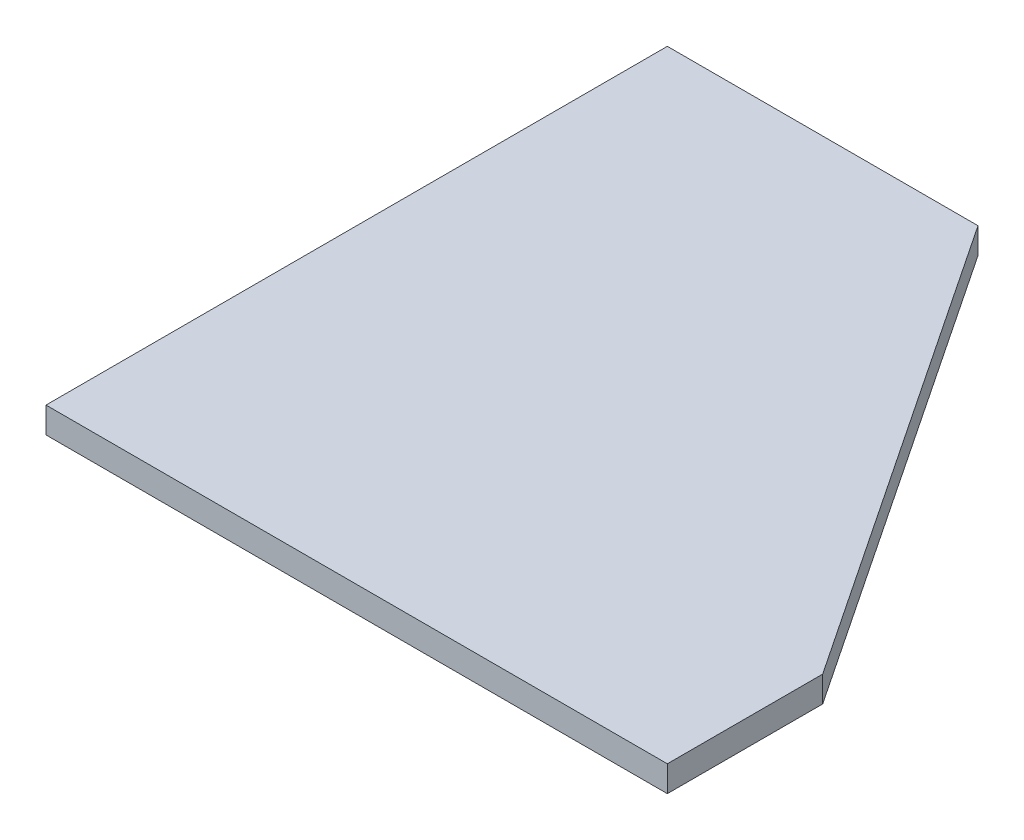
ISO-10303-21;
HEADER;
FILE_DESCRIPTION(('STEP AP214'),'2;1');
FILE_NAME('part.step','',(''),(''),'','','');
FILE_SCHEMA(('AUTOMOTIVE_DESIGN { 1 0 10303 214 1 1 1 1 }'));
ENDSEC;
DATA;
#1=APPLICATION_CONTEXT('core data for automotive mechanical design processes');
#2=APPLICATION_PROTOCOL_DEFINITION('international standard','automotive_design',2000,#1);
#3=PRODUCT_CONTEXT('',#1,'mechanical');
#4=PRODUCT('Part','Part','',(#3));
#5=PRODUCT_RELATED_PRODUCT_CATEGORY('part','',(#4));
#6=PRODUCT_DEFINITION_FORMATION('','',#4);
#7=PRODUCT_DEFINITION_CONTEXT('part definition',#1,'design');
#8=PRODUCT_DEFINITION('design','',#6,#7);
#9=PRODUCT_DEFINITION_SHAPE('','',#8);
#10=(LENGTH_UNIT() NAMED_UNIT(*) SI_UNIT(.MILLI.,.METRE.));
#11=(NAMED_UNIT(*) PLANE_ANGLE_UNIT() SI_UNIT($,.RADIAN.));
#12=(NAMED_UNIT(*) SI_UNIT($,.STERADIAN.) SOLID_ANGLE_UNIT());
#13=UNCERTAINTY_MEASURE_WITH_UNIT(LENGTH_MEASURE(1.E-05),#10,'distance_accuracy_value','');
#14=(GEOMETRIC_REPRESENTATION_CONTEXT(3) GLOBAL_UNCERTAINTY_ASSIGNED_CONTEXT((#13)) GLOBAL_UNIT_ASSIGNED_CONTEXT((#10,
#11,#12)) REPRESENTATION_CONTEXT('',''));
#15=CARTESIAN_POINT('',(0.,0.,0.));
#16=DIRECTION('',(0.,0.,1.));
#17=DIRECTION('',(1.,0.,0.));
#18=AXIS2_PLACEMENT_3D('',#15,#16,#17);
#19=CARTESIAN_POINT('',(152.4,6.35,0.));
#20=DIRECTION('',(0.,0.,-1.));
#21=DIRECTION('',(-1.,0.,0.));
#22=AXIS2_PLACEMENT_3D('',#19,#20,#21);
#23=PLANE('',#22);
#24=DIRECTION('',(1.,0.,0.));
#25=VECTOR('',#24,1.);
#26=CARTESIAN_POINT('',(152.4,0.,0.));
#27=LINE('',#26,#25);
#28=CARTESIAN_POINT('',(0.,0.,0.));
#29=VERTEX_POINT('',#28);
#30=CARTESIAN_POINT('',(152.4,0.,0.));
#31=VERTEX_POINT('',#30);
#32=EDGE_CURVE('E107',#29,#31,#27,.T.);
#33=ORIENTED_EDGE('',*,*,#32,.T.);
#34=DIRECTION('',(0.,-1.,0.));
#35=VECTOR('',#34,1.);
#36=CARTESIAN_POINT('',(152.4,6.35,0.));
#37=LINE('',#36,#35);
#38=CARTESIAN_POINT('',(152.4,6.35,0.));
#39=VERTEX_POINT('',#38);
#40=EDGE_CURVE('E11',#39,#31,#37,.T.);
#41=ORIENTED_EDGE('',*,*,#40,.F.);
#42=DIRECTION('',(1.,0.,0.));
#43=VECTOR('',#42,1.);
#44=CARTESIAN_POINT('',(152.4,6.35,0.));
#45=LINE('',#44,#43);
#46=CARTESIAN_POINT('',(0.,6.35,0.));
#47=VERTEX_POINT('',#46);
#48=EDGE_CURVE('E115',#47,#39,#45,.T.);
#49=ORIENTED_EDGE('',*,*,#48,.F.);
#50=DIRECTION('',(0.,-1.,0.));
#51=VECTOR('',#50,1.);
#52=CARTESIAN_POINT('',(0.,6.35,0.));
#53=LINE('',#52,#51);
#54=EDGE_CURVE('E103',#47,#29,#53,.T.);
#55=ORIENTED_EDGE('',*,*,#54,.T.);
#56=EDGE_LOOP('',(#33,#41,#49,#55));
#57=FACE_BOUND('',#56,.T.);
#58=ADVANCED_FACE('F33',(#57),#23,.F.);
#59=CARTESIAN_POINT('',(152.4,6.35,-38.1));
#60=DIRECTION('',(-1.,0.,0.));
#61=DIRECTION('',(0.,0.,1.));
#62=AXIS2_PLACEMENT_3D('',#59,#60,#61);
#63=PLANE('',#62);
#64=DIRECTION('',(0.,0.,-1.));
#65=VECTOR('',#64,1.);
#66=CARTESIAN_POINT('',(152.4,0.,-38.1));
#67=LINE('',#66,#65);
#68=CARTESIAN_POINT('',(152.4,0.,-38.1));
#69=VERTEX_POINT('',#68);
#70=EDGE_CURVE('E110',#31,#69,#67,.T.);
#71=ORIENTED_EDGE('',*,*,#70,.T.);
#72=DIRECTION('',(0.,-1.,0.));
#73=VECTOR('',#72,1.);
#74=CARTESIAN_POINT('',(152.4,6.35,-38.1));
#75=LINE('',#74,#73);
#76=CARTESIAN_POINT('',(152.4,6.35,-38.1));
#77=VERTEX_POINT('',#76);
#78=EDGE_CURVE('E41',#77,#69,#75,.T.);
#79=ORIENTED_EDGE('',*,*,#78,.F.);
#80=DIRECTION('',(0.,0.,-1.));
#81=VECTOR('',#80,1.);
#82=CARTESIAN_POINT('',(152.4,6.35,-38.1));
#83=LINE('',#82,#81);
#84=EDGE_CURVE('E83',#39,#77,#83,.T.);
#85=ORIENTED_EDGE('',*,*,#84,.F.);
#86=ORIENTED_EDGE('',*,*,#40,.T.);
#87=EDGE_LOOP('',(#71,#79,#85,#86));
#88=FACE_BOUND('',#87,.T.);
#89=ADVANCED_FACE('F134',(#88),#63,.F.);
#90=CARTESIAN_POINT('',(76.2,6.35,-152.4));
#91=DIRECTION('',(-0.832050294337844,0.,0.554700196225229));
#92=DIRECTION('',(0.554700196225229,0.,0.832050294337844));
#93=AXIS2_PLACEMENT_3D('',#90,#91,#92);
#94=PLANE('',#93);
#95=DIRECTION('',(-0.554700196225229,0.,-0.832050294337844));
#96=VECTOR('',#95,1.);
#97=CARTESIAN_POINT('',(76.2,0.,-152.4));
#98=LINE('',#97,#96);
#99=CARTESIAN_POINT('',(76.2,0.,-152.4));
#100=VERTEX_POINT('',#99);
#101=EDGE_CURVE('E98',#69,#100,#98,.T.);
#102=ORIENTED_EDGE('',*,*,#101,.T.);
#103=DIRECTION('',(0.,-1.,0.));
#104=VECTOR('',#103,1.);
#105=CARTESIAN_POINT('',(76.2,6.35,-152.4));
#106=LINE('',#105,#104);
#107=CARTESIAN_POINT('',(76.2,6.35,-152.4));
#108=VERTEX_POINT('',#107);
#109=EDGE_CURVE('E95',#108,#100,#106,.T.);
#110=ORIENTED_EDGE('',*,*,#109,.F.);
#111=DIRECTION('',(-0.554700196225229,0.,-0.832050294337844));
#112=VECTOR('',#111,1.);
#113=CARTESIAN_POINT('',(76.2,6.35,-152.4));
#114=LINE('',#113,#112);
#115=EDGE_CURVE('E87',#77,#108,#114,.T.);
#116=ORIENTED_EDGE('',*,*,#115,.F.);
#117=ORIENTED_EDGE('',*,*,#78,.T.);
#118=EDGE_LOOP('',(#102,#110,#116,#117));
#119=FACE_BOUND('',#118,.T.);
#120=ADVANCED_FACE('F96',(#119),#94,.F.);
#121=CARTESIAN_POINT('',(0.,6.35,-152.4));
#122=DIRECTION('',(0.,0.,1.));
#123=DIRECTION('',(1.,0.,0.));
#124=AXIS2_PLACEMENT_3D('',#121,#122,#123);
#125=PLANE('',#124);
#126=DIRECTION('',(-1.,0.,0.));
#127=VECTOR('',#126,1.);
#128=CARTESIAN_POINT('',(0.,0.,-152.4));
#129=LINE('',#128,#127);
#130=CARTESIAN_POINT('',(0.,0.,-152.4));
#131=VERTEX_POINT('',#130);
#132=EDGE_CURVE('E69',#100,#131,#129,.T.);
#133=ORIENTED_EDGE('',*,*,#132,.T.);
#134=DIRECTION('',(0.,-1.,0.));
#135=VECTOR('',#134,1.);
#136=CARTESIAN_POINT('',(0.,6.35,-152.4));
#137=LINE('',#136,#135);
#138=CARTESIAN_POINT('',(0.,6.35,-152.4));
#139=VERTEX_POINT('',#138);
#140=EDGE_CURVE('E99',#139,#131,#137,.T.);
#141=ORIENTED_EDGE('',*,*,#140,.F.);
#142=DIRECTION('',(-1.,0.,0.));
#143=VECTOR('',#142,1.);
#144=CARTESIAN_POINT('',(0.,6.35,-152.4));
#145=LINE('',#144,#143);
#146=EDGE_CURVE('E91',#108,#139,#145,.T.);
#147=ORIENTED_EDGE('',*,*,#146,.F.);
#148=ORIENTED_EDGE('',*,*,#109,.T.);
#149=EDGE_LOOP('',(#133,#141,#147,#148));
#150=FACE_BOUND('',#149,.T.);
#151=ADVANCED_FACE('F101',(#150),#125,.F.);
#152=CARTESIAN_POINT('',(0.,6.35,0.));
#153=DIRECTION('',(1.,0.,0.));
#154=DIRECTION('',(0.,0.,-1.));
#155=AXIS2_PLACEMENT_3D('',#152,#153,#154);
#156=PLANE('',#155);
#157=DIRECTION('',(0.,0.,1.));
#158=VECTOR('',#157,1.);
#159=CARTESIAN_POINT('',(0.,0.,0.));
#160=LINE('',#159,#158);
#161=EDGE_CURVE('E75',#131,#29,#160,.T.);
#162=ORIENTED_EDGE('',*,*,#161,.T.);
#163=ORIENTED_EDGE('',*,*,#54,.F.);
#164=DIRECTION('',(0.,0.,1.));
#165=VECTOR('',#164,1.);
#166=CARTESIAN_POINT('',(0.,6.35,0.));
#167=LINE('',#166,#165);
#168=EDGE_CURVE('E49',#139,#47,#167,.T.);
#169=ORIENTED_EDGE('',*,*,#168,.F.);
#170=ORIENTED_EDGE('',*,*,#140,.T.);
#171=EDGE_LOOP('',(#162,#163,#169,#170));
#172=FACE_BOUND('',#171,.T.);
#173=ADVANCED_FACE('F123',(#172),#156,.F.);
#174=CARTESIAN_POINT('',(0.,6.35,0.));
#175=DIRECTION('',(0.,-1.,0.));
#176=DIRECTION('',(0.,0.,-1.));
#177=AXIS2_PLACEMENT_3D('',#174,#175,#176);
#178=PLANE('',#177);
#179=ORIENTED_EDGE('',*,*,#48,.T.);
#180=ORIENTED_EDGE('',*,*,#84,.T.);
#181=ORIENTED_EDGE('',*,*,#115,.T.);
#182=ORIENTED_EDGE('',*,*,#146,.T.);
#183=ORIENTED_EDGE('',*,*,#168,.T.);
#184=EDGE_LOOP('',(#179,#180,#181,#182,#183));
#185=FACE_BOUND('',#184,.T.);
#186=ADVANCED_FACE('F89',(#185),#178,.F.);
#187=CARTESIAN_POINT('',(0.,0.,0.));
#188=DIRECTION('',(0.,-1.,0.));
#189=DIRECTION('',(0.,0.,-1.));
#190=AXIS2_PLACEMENT_3D('',#187,#188,#189);
#191=PLANE('',#190);
#192=ORIENTED_EDGE('',*,*,#32,.F.);
#193=ORIENTED_EDGE('',*,*,#161,.F.);
#194=ORIENTED_EDGE('',*,*,#132,.F.);
#195=ORIENTED_EDGE('',*,*,#101,.F.);
#196=ORIENTED_EDGE('',*,*,#70,.F.);
#197=EDGE_LOOP('',(#192,#193,#194,#195,#196));
#198=FACE_BOUND('',#197,.T.);
#199=ADVANCED_FACE('F119',(#198),#191,.T.);
#200=CLOSED_SHELL('',(#58,#89,#120,#151,#173,#186,#199));
#201=MANIFOLD_SOLID_BREP('B2',#200);
#202=ADVANCED_BREP_SHAPE_REPRESENTATION('',(#18,#201),#14);
#203=SHAPE_DEFINITION_REPRESENTATION(#9,#202);
ENDSEC;
END-ISO-10303-21;
